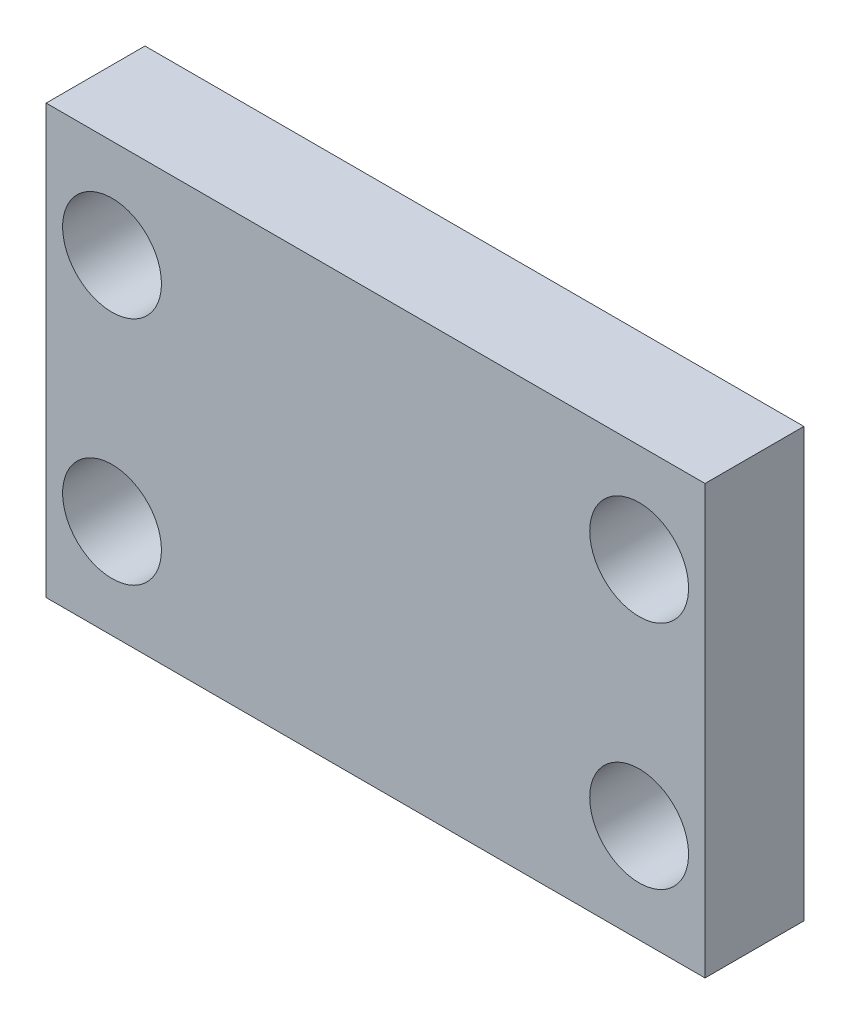
ISO-10303-21;
HEADER;
FILE_DESCRIPTION(('STEP AP214'),'2;1');
FILE_NAME('part.step','',(''),(''),'','','');
FILE_SCHEMA(('AUTOMOTIVE_DESIGN { 1 0 10303 214 1 1 1 1 }'));
ENDSEC;
DATA;
#1=APPLICATION_CONTEXT('core data for automotive mechanical design processes');
#2=APPLICATION_PROTOCOL_DEFINITION('international standard','automotive_design',2000,#1);
#3=PRODUCT_CONTEXT('',#1,'mechanical');
#4=PRODUCT('Part','Part','',(#3));
#5=PRODUCT_RELATED_PRODUCT_CATEGORY('part','',(#4));
#6=PRODUCT_DEFINITION_FORMATION('','',#4);
#7=PRODUCT_DEFINITION_CONTEXT('part definition',#1,'design');
#8=PRODUCT_DEFINITION('design','',#6,#7);
#9=PRODUCT_DEFINITION_SHAPE('','',#8);
#10=(LENGTH_UNIT() NAMED_UNIT(*) SI_UNIT(.MILLI.,.METRE.));
#11=(NAMED_UNIT(*) PLANE_ANGLE_UNIT() SI_UNIT($,.RADIAN.));
#12=(NAMED_UNIT(*) SI_UNIT($,.STERADIAN.) SOLID_ANGLE_UNIT());
#13=UNCERTAINTY_MEASURE_WITH_UNIT(LENGTH_MEASURE(1.E-05),#10,'distance_accuracy_value','');
#14=(GEOMETRIC_REPRESENTATION_CONTEXT(3) GLOBAL_UNCERTAINTY_ASSIGNED_CONTEXT((#13)) GLOBAL_UNIT_ASSIGNED_CONTEXT((#10,
#11,#12)) REPRESENTATION_CONTEXT('',''));
#15=CARTESIAN_POINT('',(0.,0.,0.));
#16=DIRECTION('',(0.,0.,1.));
#17=DIRECTION('',(1.,0.,0.));
#18=AXIS2_PLACEMENT_3D('',#15,#16,#17);
#19=CARTESIAN_POINT('',(0.,0.,3.));
#20=DIRECTION('',(0.,0.,-1.));
#21=DIRECTION('',(-1.,0.,0.));
#22=AXIS2_PLACEMENT_3D('',#19,#20,#21);
#23=PLANE('',#22);
#24=DIRECTION('',(0.,1.,0.));
#25=VECTOR('',#24,1.);
#26=CARTESIAN_POINT('',(10.,-6.5,3.));
#27=LINE('',#26,#25);
#28=CARTESIAN_POINT('',(10.,-6.5,3.));
#29=VERTEX_POINT('',#28);
#30=CARTESIAN_POINT('',(10.,6.5,3.));
#31=VERTEX_POINT('',#30);
#32=EDGE_CURVE('E98',#29,#31,#27,.T.);
#33=ORIENTED_EDGE('',*,*,#32,.T.);
#34=DIRECTION('',(-1.,0.,0.));
#35=VECTOR('',#34,1.);
#36=CARTESIAN_POINT('',(-10.,6.5,3.));
#37=LINE('',#36,#35);
#38=CARTESIAN_POINT('',(-10.,6.5,3.));
#39=VERTEX_POINT('',#38);
#40=EDGE_CURVE('E93',#31,#39,#37,.T.);
#41=ORIENTED_EDGE('',*,*,#40,.T.);
#42=DIRECTION('',(0.,-1.,0.));
#43=VECTOR('',#42,1.);
#44=CARTESIAN_POINT('',(-10.,-6.5,3.));
#45=LINE('',#44,#43);
#46=CARTESIAN_POINT('',(-10.,-6.5,3.));
#47=VERTEX_POINT('',#46);
#48=EDGE_CURVE('E96',#39,#47,#45,.T.);
#49=ORIENTED_EDGE('',*,*,#48,.T.);
#50=DIRECTION('',(1.,0.,0.));
#51=VECTOR('',#50,1.);
#52=CARTESIAN_POINT('',(-10.,-6.5,3.));
#53=LINE('',#52,#51);
#54=EDGE_CURVE('E63',#47,#29,#53,.T.);
#55=ORIENTED_EDGE('',*,*,#54,.T.);
#56=EDGE_LOOP('',(#33,#41,#49,#55));
#57=FACE_BOUND('',#56,.T.);
#58=CARTESIAN_POINT('',(-8.,3.5,3.));
#59=DIRECTION('',(0.,0.,1.));
#60=DIRECTION('',(1.,0.,0.));
#61=AXIS2_PLACEMENT_3D('',#58,#59,#60);
#62=CIRCLE('',#61,1.5);
#63=CARTESIAN_POINT('',(-6.5,3.5,3.));
#64=VERTEX_POINT('',#63);
#65=EDGE_CURVE('E118',#64,#64,#62,.T.);
#66=ORIENTED_EDGE('',*,*,#65,.F.);
#67=EDGE_LOOP('',(#66));
#68=FACE_BOUND('',#67,.T.);
#69=CARTESIAN_POINT('',(-8.,-3.5,3.));
#70=DIRECTION('',(0.,0.,1.));
#71=DIRECTION('',(1.,0.,0.));
#72=AXIS2_PLACEMENT_3D('',#69,#70,#71);
#73=CIRCLE('',#72,1.5);
#74=CARTESIAN_POINT('',(-6.5,-3.5,3.));
#75=VERTEX_POINT('',#74);
#76=EDGE_CURVE('E140',#75,#75,#73,.T.);
#77=ORIENTED_EDGE('',*,*,#76,.F.);
#78=EDGE_LOOP('',(#77));
#79=FACE_BOUND('',#78,.T.);
#80=CARTESIAN_POINT('',(8.,3.49999999999999,3.));
#81=DIRECTION('',(0.,0.,1.));
#82=DIRECTION('',(-1.,0.,0.));
#83=AXIS2_PLACEMENT_3D('',#80,#81,#82);
#84=CIRCLE('',#83,1.5);
#85=CARTESIAN_POINT('',(6.5,3.49999999999999,3.));
#86=VERTEX_POINT('',#85);
#87=EDGE_CURVE('E148',#86,#86,#84,.T.);
#88=ORIENTED_EDGE('',*,*,#87,.F.);
#89=EDGE_LOOP('',(#88));
#90=FACE_BOUND('',#89,.T.);
#91=CARTESIAN_POINT('',(8.,-3.50000000000001,3.));
#92=DIRECTION('',(0.,0.,1.));
#93=DIRECTION('',(-1.,0.,0.));
#94=AXIS2_PLACEMENT_3D('',#91,#92,#93);
#95=CIRCLE('',#94,1.5);
#96=CARTESIAN_POINT('',(6.5,-3.50000000000001,3.));
#97=VERTEX_POINT('',#96);
#98=EDGE_CURVE('E156',#97,#97,#95,.T.);
#99=ORIENTED_EDGE('',*,*,#98,.F.);
#100=EDGE_LOOP('',(#99));
#101=FACE_BOUND('',#100,.T.);
#102=ADVANCED_FACE('F45',(#57,#68,#79,#90,#101),#23,.F.);
#103=CARTESIAN_POINT('',(0.,0.,0.));
#104=DIRECTION('',(0.,0.,-1.));
#105=DIRECTION('',(-1.,0.,0.));
#106=AXIS2_PLACEMENT_3D('',#103,#104,#105);
#107=PLANE('',#106);
#108=CARTESIAN_POINT('',(8.,3.49999999999999,0.));
#109=DIRECTION('',(0.,0.,1.));
#110=DIRECTION('',(-1.,0.,0.));
#111=AXIS2_PLACEMENT_3D('',#108,#109,#110);
#112=CIRCLE('',#111,1.5);
#113=CARTESIAN_POINT('',(6.5,3.49999999999999,0.));
#114=VERTEX_POINT('',#113);
#115=EDGE_CURVE('E152',#114,#114,#112,.T.);
#116=ORIENTED_EDGE('',*,*,#115,.T.);
#117=EDGE_LOOP('',(#116));
#118=FACE_BOUND('',#117,.T.);
#119=CARTESIAN_POINT('',(-8.,3.5,0.));
#120=DIRECTION('',(0.,0.,1.));
#121=DIRECTION('',(1.,0.,0.));
#122=AXIS2_PLACEMENT_3D('',#119,#120,#121);
#123=CIRCLE('',#122,1.5);
#124=CARTESIAN_POINT('',(-6.5,3.5,0.));
#125=VERTEX_POINT('',#124);
#126=EDGE_CURVE('E136',#125,#125,#123,.T.);
#127=ORIENTED_EDGE('',*,*,#126,.T.);
#128=EDGE_LOOP('',(#127));
#129=FACE_BOUND('',#128,.T.);
#130=DIRECTION('',(0.,1.,0.));
#131=VECTOR('',#130,1.);
#132=CARTESIAN_POINT('',(10.,-6.5,0.));
#133=LINE('',#132,#131);
#134=CARTESIAN_POINT('',(10.,-6.5,0.));
#135=VERTEX_POINT('',#134);
#136=CARTESIAN_POINT('',(10.,6.5,0.));
#137=VERTEX_POINT('',#136);
#138=EDGE_CURVE('E114',#135,#137,#133,.T.);
#139=ORIENTED_EDGE('',*,*,#138,.F.);
#140=DIRECTION('',(1.,0.,0.));
#141=VECTOR('',#140,1.);
#142=CARTESIAN_POINT('',(-10.,-6.5,0.));
#143=LINE('',#142,#141);
#144=CARTESIAN_POINT('',(-10.,-6.5,0.));
#145=VERTEX_POINT('',#144);
#146=EDGE_CURVE('E86',#145,#135,#143,.T.);
#147=ORIENTED_EDGE('',*,*,#146,.F.);
#148=DIRECTION('',(0.,-1.,0.));
#149=VECTOR('',#148,1.);
#150=CARTESIAN_POINT('',(-10.,-6.5,0.));
#151=LINE('',#150,#149);
#152=CARTESIAN_POINT('',(-10.,6.5,0.));
#153=VERTEX_POINT('',#152);
#154=EDGE_CURVE('E80',#153,#145,#151,.T.);
#155=ORIENTED_EDGE('',*,*,#154,.F.);
#156=DIRECTION('',(-1.,0.,0.));
#157=VECTOR('',#156,1.);
#158=CARTESIAN_POINT('',(-10.,6.5,0.));
#159=LINE('',#158,#157);
#160=EDGE_CURVE('E103',#137,#153,#159,.T.);
#161=ORIENTED_EDGE('',*,*,#160,.F.);
#162=EDGE_LOOP('',(#139,#147,#155,#161));
#163=FACE_BOUND('',#162,.T.);
#164=CARTESIAN_POINT('',(-8.,-3.5,0.));
#165=DIRECTION('',(0.,0.,1.));
#166=DIRECTION('',(1.,0.,0.));
#167=AXIS2_PLACEMENT_3D('',#164,#165,#166);
#168=CIRCLE('',#167,1.5);
#169=CARTESIAN_POINT('',(-6.5,-3.5,0.));
#170=VERTEX_POINT('',#169);
#171=EDGE_CURVE('E144',#170,#170,#168,.T.);
#172=ORIENTED_EDGE('',*,*,#171,.T.);
#173=EDGE_LOOP('',(#172));
#174=FACE_BOUND('',#173,.T.);
#175=CARTESIAN_POINT('',(8.,-3.50000000000001,0.));
#176=DIRECTION('',(0.,0.,1.));
#177=DIRECTION('',(-1.,0.,0.));
#178=AXIS2_PLACEMENT_3D('',#175,#176,#177);
#179=CIRCLE('',#178,1.5);
#180=CARTESIAN_POINT('',(6.5,-3.50000000000001,0.));
#181=VERTEX_POINT('',#180);
#182=EDGE_CURVE('E160',#181,#181,#179,.T.);
#183=ORIENTED_EDGE('',*,*,#182,.T.);
#184=EDGE_LOOP('',(#183));
#185=FACE_BOUND('',#184,.T.);
#186=ADVANCED_FACE('F131',(#118,#129,#163,#174,#185),#107,.T.);
#187=CARTESIAN_POINT('',(10.,-6.5,3.));
#188=DIRECTION('',(-1.,0.,0.));
#189=DIRECTION('',(0.,0.,1.));
#190=AXIS2_PLACEMENT_3D('',#187,#188,#189);
#191=PLANE('',#190);
#192=ORIENTED_EDGE('',*,*,#138,.T.);
#193=DIRECTION('',(0.,0.,-1.));
#194=VECTOR('',#193,1.);
#195=CARTESIAN_POINT('',(10.,6.5,3.));
#196=LINE('',#195,#194);
#197=EDGE_CURVE('E11',#31,#137,#196,.T.);
#198=ORIENTED_EDGE('',*,*,#197,.F.);
#199=ORIENTED_EDGE('',*,*,#32,.F.);
#200=DIRECTION('',(0.,0.,-1.));
#201=VECTOR('',#200,1.);
#202=CARTESIAN_POINT('',(10.,-6.5,3.));
#203=LINE('',#202,#201);
#204=EDGE_CURVE('E110',#29,#135,#203,.T.);
#205=ORIENTED_EDGE('',*,*,#204,.T.);
#206=EDGE_LOOP('',(#192,#198,#199,#205));
#207=FACE_BOUND('',#206,.T.);
#208=ADVANCED_FACE('F47',(#207),#191,.F.);
#209=CARTESIAN_POINT('',(-10.,6.5,3.));
#210=DIRECTION('',(0.,-1.,0.));
#211=DIRECTION('',(0.,0.,-1.));
#212=AXIS2_PLACEMENT_3D('',#209,#210,#211);
#213=PLANE('',#212);
#214=ORIENTED_EDGE('',*,*,#160,.T.);
#215=DIRECTION('',(0.,0.,-1.));
#216=VECTOR('',#215,1.);
#217=CARTESIAN_POINT('',(-10.,6.5,3.));
#218=LINE('',#217,#216);
#219=EDGE_CURVE('E55',#39,#153,#218,.T.);
#220=ORIENTED_EDGE('',*,*,#219,.F.);
#221=ORIENTED_EDGE('',*,*,#40,.F.);
#222=ORIENTED_EDGE('',*,*,#197,.T.);
#223=EDGE_LOOP('',(#214,#220,#221,#222));
#224=FACE_BOUND('',#223,.T.);
#225=ADVANCED_FACE('F102',(#224),#213,.F.);
#226=CARTESIAN_POINT('',(-10.,-6.5,3.));
#227=DIRECTION('',(1.,0.,0.));
#228=DIRECTION('',(0.,0.,-1.));
#229=AXIS2_PLACEMENT_3D('',#226,#227,#228);
#230=PLANE('',#229);
#231=ORIENTED_EDGE('',*,*,#154,.T.);
#232=DIRECTION('',(0.,0.,-1.));
#233=VECTOR('',#232,1.);
#234=CARTESIAN_POINT('',(-10.,-6.5,3.));
#235=LINE('',#234,#233);
#236=EDGE_CURVE('E105',#47,#145,#235,.T.);
#237=ORIENTED_EDGE('',*,*,#236,.F.);
#238=ORIENTED_EDGE('',*,*,#48,.F.);
#239=ORIENTED_EDGE('',*,*,#219,.T.);
#240=EDGE_LOOP('',(#231,#237,#238,#239));
#241=FACE_BOUND('',#240,.T.);
#242=ADVANCED_FACE('F106',(#241),#230,.F.);
#243=CARTESIAN_POINT('',(-10.,-6.5,3.));
#244=DIRECTION('',(0.,1.,0.));
#245=DIRECTION('',(0.,0.,1.));
#246=AXIS2_PLACEMENT_3D('',#243,#244,#245);
#247=PLANE('',#246);
#248=ORIENTED_EDGE('',*,*,#146,.T.);
#249=ORIENTED_EDGE('',*,*,#204,.F.);
#250=ORIENTED_EDGE('',*,*,#54,.F.);
#251=ORIENTED_EDGE('',*,*,#236,.T.);
#252=EDGE_LOOP('',(#248,#249,#250,#251));
#253=FACE_BOUND('',#252,.T.);
#254=ADVANCED_FACE('F128',(#253),#247,.F.);
#255=CARTESIAN_POINT('',(-8.,3.5,3.));
#256=DIRECTION('',(0.,0.,-1.));
#257=DIRECTION('',(-1.,0.,0.));
#258=AXIS2_PLACEMENT_3D('',#255,#256,#257);
#259=CYLINDRICAL_SURFACE('',#258,1.5);
#260=ORIENTED_EDGE('',*,*,#65,.T.);
#261=EDGE_LOOP('',(#260));
#262=FACE_BOUND('',#261,.T.);
#263=ORIENTED_EDGE('',*,*,#126,.F.);
#264=EDGE_LOOP('',(#263));
#265=FACE_BOUND('',#264,.T.);
#266=ADVANCED_FACE('F179',(#262,#265),#259,.F.);
#267=CARTESIAN_POINT('',(-8.,-3.5,3.));
#268=DIRECTION('',(0.,0.,-1.));
#269=DIRECTION('',(-1.,0.,0.));
#270=AXIS2_PLACEMENT_3D('',#267,#268,#269);
#271=CYLINDRICAL_SURFACE('',#270,1.5);
#272=ORIENTED_EDGE('',*,*,#76,.T.);
#273=EDGE_LOOP('',(#272));
#274=FACE_BOUND('',#273,.T.);
#275=ORIENTED_EDGE('',*,*,#171,.F.);
#276=EDGE_LOOP('',(#275));
#277=FACE_BOUND('',#276,.T.);
#278=ADVANCED_FACE('F224',(#274,#277),#271,.F.);
#279=CARTESIAN_POINT('',(8.,3.49999999999999,3.));
#280=DIRECTION('',(0.,0.,-1.));
#281=DIRECTION('',(-1.,0.,0.));
#282=AXIS2_PLACEMENT_3D('',#279,#280,#281);
#283=CYLINDRICAL_SURFACE('',#282,1.5);
#284=ORIENTED_EDGE('',*,*,#87,.T.);
#285=EDGE_LOOP('',(#284));
#286=FACE_BOUND('',#285,.T.);
#287=ORIENTED_EDGE('',*,*,#115,.F.);
#288=EDGE_LOOP('',(#287));
#289=FACE_BOUND('',#288,.T.);
#290=ADVANCED_FACE('F232',(#286,#289),#283,.F.);
#291=CARTESIAN_POINT('',(8.,-3.50000000000001,3.));
#292=DIRECTION('',(0.,0.,-1.));
#293=DIRECTION('',(-1.,0.,0.));
#294=AXIS2_PLACEMENT_3D('',#291,#292,#293);
#295=CYLINDRICAL_SURFACE('',#294,1.5);
#296=ORIENTED_EDGE('',*,*,#98,.T.);
#297=EDGE_LOOP('',(#296));
#298=FACE_BOUND('',#297,.T.);
#299=ORIENTED_EDGE('',*,*,#182,.F.);
#300=EDGE_LOOP('',(#299));
#301=FACE_BOUND('',#300,.T.);
#302=ADVANCED_FACE('F168',(#298,#301),#295,.F.);
#303=CLOSED_SHELL('',(#102,#186,#208,#225,#242,#254,#266,#278,#290,#302));
#304=MANIFOLD_SOLID_BREP('B2',#303);
#305=ADVANCED_BREP_SHAPE_REPRESENTATION('',(#18,#304),#14);
#306=SHAPE_DEFINITION_REPRESENTATION(#9,#305);
ENDSEC;
END-ISO-10303-21;
